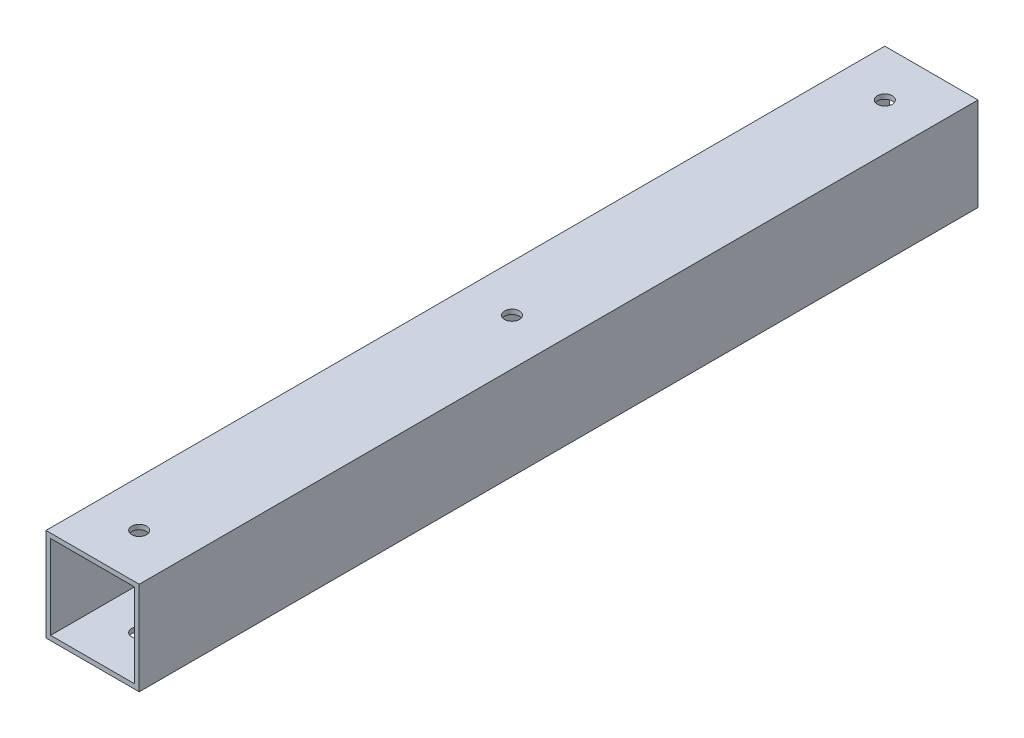
ISO-10303-21;
HEADER;
FILE_DESCRIPTION(('STEP AP214'),'2;1');
FILE_NAME('part.step','',(''),(''),'','','');
FILE_SCHEMA(('AUTOMOTIVE_DESIGN { 1 0 10303 214 1 1 1 1 }'));
ENDSEC;
DATA;
#1=APPLICATION_CONTEXT('core data for automotive mechanical design processes');
#2=APPLICATION_PROTOCOL_DEFINITION('international standard','automotive_design',2000,#1);
#3=PRODUCT_CONTEXT('',#1,'mechanical');
#4=PRODUCT('Part','Part','',(#3));
#5=PRODUCT_RELATED_PRODUCT_CATEGORY('part','',(#4));
#6=PRODUCT_DEFINITION_FORMATION('','',#4);
#7=PRODUCT_DEFINITION_CONTEXT('part definition',#1,'design');
#8=PRODUCT_DEFINITION('design','',#6,#7);
#9=PRODUCT_DEFINITION_SHAPE('','',#8);
#10=(LENGTH_UNIT() NAMED_UNIT(*) SI_UNIT(.MILLI.,.METRE.));
#11=(NAMED_UNIT(*) PLANE_ANGLE_UNIT() SI_UNIT($,.RADIAN.));
#12=(NAMED_UNIT(*) SI_UNIT($,.STERADIAN.) SOLID_ANGLE_UNIT());
#13=UNCERTAINTY_MEASURE_WITH_UNIT(LENGTH_MEASURE(1.E-05),#10,'distance_accuracy_value','');
#14=(GEOMETRIC_REPRESENTATION_CONTEXT(3) GLOBAL_UNCERTAINTY_ASSIGNED_CONTEXT((#13)) GLOBAL_UNIT_ASSIGNED_CONTEXT((#10,
#11,#12)) REPRESENTATION_CONTEXT('',''));
#15=CARTESIAN_POINT('',(0.,0.,0.));
#16=DIRECTION('',(0.,0.,1.));
#17=DIRECTION('',(1.,0.,0.));
#18=AXIS2_PLACEMENT_3D('',#15,#16,#17);
#19=CARTESIAN_POINT('',(0.,0.,180.));
#20=DIRECTION('',(0.,0.,1.));
#21=DIRECTION('',(1.,0.,0.));
#22=AXIS2_PLACEMENT_3D('',#19,#20,#21);
#23=PLANE('',#22);
#24=DIRECTION('',(0.,1.,0.));
#25=VECTOR('',#24,1.);
#26=CARTESIAN_POINT('',(10.,10.,180.));
#27=LINE('',#26,#25);
#28=CARTESIAN_POINT('',(10.,-10.,180.));
#29=VERTEX_POINT('',#28);
#30=CARTESIAN_POINT('',(10.,10.,180.));
#31=VERTEX_POINT('',#30);
#32=EDGE_CURVE('E162',#29,#31,#27,.T.);
#33=ORIENTED_EDGE('',*,*,#32,.T.);
#34=DIRECTION('',(-1.,0.,0.));
#35=VECTOR('',#34,1.);
#36=CARTESIAN_POINT('',(-10.,10.,180.));
#37=LINE('',#36,#35);
#38=CARTESIAN_POINT('',(-10.,10.,180.));
#39=VERTEX_POINT('',#38);
#40=EDGE_CURVE('E170',#31,#39,#37,.T.);
#41=ORIENTED_EDGE('',*,*,#40,.T.);
#42=DIRECTION('',(0.,-1.,0.));
#43=VECTOR('',#42,1.);
#44=CARTESIAN_POINT('',(-10.,10.,180.));
#45=LINE('',#44,#43);
#46=CARTESIAN_POINT('',(-10.,-10.,180.));
#47=VERTEX_POINT('',#46);
#48=EDGE_CURVE('E173',#39,#47,#45,.T.);
#49=ORIENTED_EDGE('',*,*,#48,.T.);
#50=DIRECTION('',(1.,0.,0.));
#51=VECTOR('',#50,1.);
#52=CARTESIAN_POINT('',(-10.,-10.,180.));
#53=LINE('',#52,#51);
#54=EDGE_CURVE('E175',#47,#29,#53,.T.);
#55=ORIENTED_EDGE('',*,*,#54,.T.);
#56=EDGE_LOOP('',(#33,#41,#49,#55));
#57=FACE_BOUND('',#56,.T.);
#58=DIRECTION('',(-1.,0.,0.));
#59=VECTOR('',#58,1.);
#60=CARTESIAN_POINT('',(-9.,9.,180.));
#61=LINE('',#60,#59);
#62=CARTESIAN_POINT('',(9.,9.,180.));
#63=VERTEX_POINT('',#62);
#64=CARTESIAN_POINT('',(-9.,9.,180.));
#65=VERTEX_POINT('',#64);
#66=EDGE_CURVE('E124',#63,#65,#61,.T.);
#67=ORIENTED_EDGE('',*,*,#66,.F.);
#68=DIRECTION('',(0.,1.,0.));
#69=VECTOR('',#68,1.);
#70=CARTESIAN_POINT('',(9.,9.,180.));
#71=LINE('',#70,#69);
#72=CARTESIAN_POINT('',(9.,-9.,180.));
#73=VERTEX_POINT('',#72);
#74=EDGE_CURVE('E114',#73,#63,#71,.T.);
#75=ORIENTED_EDGE('',*,*,#74,.F.);
#76=DIRECTION('',(1.,0.,0.));
#77=VECTOR('',#76,1.);
#78=CARTESIAN_POINT('',(-9.,-9.,180.));
#79=LINE('',#78,#77);
#80=CARTESIAN_POINT('',(-9.,-9.,180.));
#81=VERTEX_POINT('',#80);
#82=EDGE_CURVE('E140',#81,#73,#79,.T.);
#83=ORIENTED_EDGE('',*,*,#82,.F.);
#84=DIRECTION('',(0.,-1.,0.));
#85=VECTOR('',#84,1.);
#86=CARTESIAN_POINT('',(-9.,9.,180.));
#87=LINE('',#86,#85);
#88=EDGE_CURVE('E131',#65,#81,#87,.T.);
#89=ORIENTED_EDGE('',*,*,#88,.F.);
#90=EDGE_LOOP('',(#67,#75,#83,#89));
#91=FACE_BOUND('',#90,.T.);
#92=ADVANCED_FACE('F44',(#57,#91),#23,.T.);
#93=CARTESIAN_POINT('',(0.,0.,0.));
#94=DIRECTION('',(0.,0.,1.));
#95=DIRECTION('',(1.,0.,0.));
#96=AXIS2_PLACEMENT_3D('',#93,#94,#95);
#97=PLANE('',#96);
#98=DIRECTION('',(0.,1.,0.));
#99=VECTOR('',#98,1.);
#100=CARTESIAN_POINT('',(10.,10.,0.));
#101=LINE('',#100,#99);
#102=CARTESIAN_POINT('',(10.,-10.,0.));
#103=VERTEX_POINT('',#102);
#104=CARTESIAN_POINT('',(10.,10.,0.));
#105=VERTEX_POINT('',#104);
#106=EDGE_CURVE('E133',#103,#105,#101,.T.);
#107=ORIENTED_EDGE('',*,*,#106,.F.);
#108=DIRECTION('',(1.,0.,0.));
#109=VECTOR('',#108,1.);
#110=CARTESIAN_POINT('',(-10.,-10.,0.));
#111=LINE('',#110,#109);
#112=CARTESIAN_POINT('',(-10.,-10.,0.));
#113=VERTEX_POINT('',#112);
#114=EDGE_CURVE('E169',#113,#103,#111,.T.);
#115=ORIENTED_EDGE('',*,*,#114,.F.);
#116=DIRECTION('',(0.,-1.,0.));
#117=VECTOR('',#116,1.);
#118=CARTESIAN_POINT('',(-10.,10.,0.));
#119=LINE('',#118,#117);
#120=CARTESIAN_POINT('',(-10.,10.,0.));
#121=VERTEX_POINT('',#120);
#122=EDGE_CURVE('E184',#121,#113,#119,.T.);
#123=ORIENTED_EDGE('',*,*,#122,.F.);
#124=DIRECTION('',(-1.,0.,0.));
#125=VECTOR('',#124,1.);
#126=CARTESIAN_POINT('',(-10.,10.,0.));
#127=LINE('',#126,#125);
#128=EDGE_CURVE('E182',#105,#121,#127,.T.);
#129=ORIENTED_EDGE('',*,*,#128,.F.);
#130=EDGE_LOOP('',(#107,#115,#123,#129));
#131=FACE_BOUND('',#130,.T.);
#132=DIRECTION('',(0.,1.,0.));
#133=VECTOR('',#132,1.);
#134=CARTESIAN_POINT('',(9.,9.,0.));
#135=LINE('',#134,#133);
#136=CARTESIAN_POINT('',(9.,-9.,0.));
#137=VERTEX_POINT('',#136);
#138=CARTESIAN_POINT('',(9.,9.,0.));
#139=VERTEX_POINT('',#138);
#140=EDGE_CURVE('E72',#137,#139,#135,.T.);
#141=ORIENTED_EDGE('',*,*,#140,.T.);
#142=DIRECTION('',(-1.,0.,0.));
#143=VECTOR('',#142,1.);
#144=CARTESIAN_POINT('',(-9.,9.,0.));
#145=LINE('',#144,#143);
#146=CARTESIAN_POINT('',(-9.,9.,0.));
#147=VERTEX_POINT('',#146);
#148=EDGE_CURVE('E129',#139,#147,#145,.T.);
#149=ORIENTED_EDGE('',*,*,#148,.T.);
#150=DIRECTION('',(0.,-1.,0.));
#151=VECTOR('',#150,1.);
#152=CARTESIAN_POINT('',(-9.,9.,0.));
#153=LINE('',#152,#151);
#154=CARTESIAN_POINT('',(-9.,-9.,0.));
#155=VERTEX_POINT('',#154);
#156=EDGE_CURVE('E147',#147,#155,#153,.T.);
#157=ORIENTED_EDGE('',*,*,#156,.T.);
#158=DIRECTION('',(1.,0.,0.));
#159=VECTOR('',#158,1.);
#160=CARTESIAN_POINT('',(-9.,-9.,0.));
#161=LINE('',#160,#159);
#162=EDGE_CURVE('E122',#155,#137,#161,.T.);
#163=ORIENTED_EDGE('',*,*,#162,.T.);
#164=EDGE_LOOP('',(#141,#149,#157,#163));
#165=FACE_BOUND('',#164,.T.);
#166=ADVANCED_FACE('F256',(#131,#165),#97,.F.);
#167=CARTESIAN_POINT('',(10.,10.,180.));
#168=DIRECTION('',(-1.,0.,0.));
#169=DIRECTION('',(0.,-1.,0.));
#170=AXIS2_PLACEMENT_3D('',#167,#168,#169);
#171=PLANE('',#170);
#172=ORIENTED_EDGE('',*,*,#106,.T.);
#173=DIRECTION('',(0.,0.,-1.));
#174=VECTOR('',#173,1.);
#175=CARTESIAN_POINT('',(10.,10.,180.));
#176=LINE('',#175,#174);
#177=EDGE_CURVE('E11',#31,#105,#176,.T.);
#178=ORIENTED_EDGE('',*,*,#177,.F.);
#179=ORIENTED_EDGE('',*,*,#32,.F.);
#180=DIRECTION('',(0.,0.,-1.));
#181=VECTOR('',#180,1.);
#182=CARTESIAN_POINT('',(10.,-10.,180.));
#183=LINE('',#182,#181);
#184=EDGE_CURVE('E179',#29,#103,#183,.T.);
#185=ORIENTED_EDGE('',*,*,#184,.T.);
#186=EDGE_LOOP('',(#172,#178,#179,#185));
#187=FACE_BOUND('',#186,.T.);
#188=ADVANCED_FACE('F50',(#187),#171,.F.);
#189=CARTESIAN_POINT('',(-10.,10.,180.));
#190=DIRECTION('',(0.,-1.,0.));
#191=DIRECTION('',(0.,0.,-1.));
#192=AXIS2_PLACEMENT_3D('',#189,#190,#191);
#193=PLANE('',#192);
#194=CARTESIAN_POINT('',(0.,10.,9.99999999999999));
#195=DIRECTION('',(0.,1.,0.));
#196=DIRECTION('',(0.,0.,1.));
#197=AXIS2_PLACEMENT_3D('',#194,#195,#196);
#198=CIRCLE('',#197,1.6);
#199=CARTESIAN_POINT('',(0.,10.,11.6));
#200=VERTEX_POINT('',#199);
#201=EDGE_CURVE('E281',#200,#200,#198,.T.);
#202=ORIENTED_EDGE('',*,*,#201,.F.);
#203=EDGE_LOOP('',(#202));
#204=FACE_BOUND('',#203,.T.);
#205=CARTESIAN_POINT('',(0.,10.,170.));
#206=DIRECTION('',(0.,1.,0.));
#207=DIRECTION('',(0.,0.,1.));
#208=AXIS2_PLACEMENT_3D('',#205,#206,#207);
#209=CIRCLE('',#208,1.6);
#210=CARTESIAN_POINT('',(0.,10.,171.6));
#211=VERTEX_POINT('',#210);
#212=EDGE_CURVE('E290',#211,#211,#209,.T.);
#213=ORIENTED_EDGE('',*,*,#212,.F.);
#214=EDGE_LOOP('',(#213));
#215=FACE_BOUND('',#214,.T.);
#216=CARTESIAN_POINT('',(0.,10.,90.));
#217=DIRECTION('',(0.,1.,0.));
#218=DIRECTION('',(0.,0.,1.));
#219=AXIS2_PLACEMENT_3D('',#216,#217,#218);
#220=CIRCLE('',#219,1.6);
#221=CARTESIAN_POINT('',(0.,10.,91.6));
#222=VERTEX_POINT('',#221);
#223=EDGE_CURVE('E201',#222,#222,#220,.T.);
#224=ORIENTED_EDGE('',*,*,#223,.F.);
#225=EDGE_LOOP('',(#224));
#226=FACE_BOUND('',#225,.T.);
#227=ORIENTED_EDGE('',*,*,#128,.T.);
#228=DIRECTION('',(0.,0.,-1.));
#229=VECTOR('',#228,1.);
#230=CARTESIAN_POINT('',(-10.,10.,180.));
#231=LINE('',#230,#229);
#232=EDGE_CURVE('E54',#39,#121,#231,.T.);
#233=ORIENTED_EDGE('',*,*,#232,.F.);
#234=ORIENTED_EDGE('',*,*,#40,.F.);
#235=ORIENTED_EDGE('',*,*,#177,.T.);
#236=EDGE_LOOP('',(#227,#233,#234,#235));
#237=FACE_BOUND('',#236,.T.);
#238=ADVANCED_FACE('F272',(#204,#215,#226,#237),#193,.F.);
#239=CARTESIAN_POINT('',(-10.,10.,180.));
#240=DIRECTION('',(1.,0.,0.));
#241=DIRECTION('',(0.,1.,0.));
#242=AXIS2_PLACEMENT_3D('',#239,#240,#241);
#243=PLANE('',#242);
#244=ORIENTED_EDGE('',*,*,#122,.T.);
#245=DIRECTION('',(0.,0.,-1.));
#246=VECTOR('',#245,1.);
#247=CARTESIAN_POINT('',(-10.,-10.,180.));
#248=LINE('',#247,#246);
#249=EDGE_CURVE('E194',#47,#113,#248,.T.);
#250=ORIENTED_EDGE('',*,*,#249,.F.);
#251=ORIENTED_EDGE('',*,*,#48,.F.);
#252=ORIENTED_EDGE('',*,*,#232,.T.);
#253=EDGE_LOOP('',(#244,#250,#251,#252));
#254=FACE_BOUND('',#253,.T.);
#255=ADVANCED_FACE('F271',(#254),#243,.F.);
#256=CARTESIAN_POINT('',(-10.,-10.,180.));
#257=DIRECTION('',(0.,1.,0.));
#258=DIRECTION('',(0.,0.,1.));
#259=AXIS2_PLACEMENT_3D('',#256,#257,#258);
#260=PLANE('',#259);
#261=CARTESIAN_POINT('',(0.,-10.,9.99999999999999));
#262=DIRECTION('',(0.,1.,0.));
#263=DIRECTION('',(0.,0.,1.));
#264=AXIS2_PLACEMENT_3D('',#261,#262,#263);
#265=CIRCLE('',#264,1.6);
#266=CARTESIAN_POINT('',(0.,-10.,11.6));
#267=VERTEX_POINT('',#266);
#268=EDGE_CURVE('E150',#267,#267,#265,.T.);
#269=ORIENTED_EDGE('',*,*,#268,.T.);
#270=EDGE_LOOP('',(#269));
#271=FACE_BOUND('',#270,.T.);
#272=CARTESIAN_POINT('',(0.,-10.,170.));
#273=DIRECTION('',(0.,1.,0.));
#274=DIRECTION('',(0.,0.,1.));
#275=AXIS2_PLACEMENT_3D('',#272,#273,#274);
#276=CIRCLE('',#275,1.6);
#277=CARTESIAN_POINT('',(0.,-10.,171.6));
#278=VERTEX_POINT('',#277);
#279=EDGE_CURVE('E212',#278,#278,#276,.T.);
#280=ORIENTED_EDGE('',*,*,#279,.T.);
#281=EDGE_LOOP('',(#280));
#282=FACE_BOUND('',#281,.T.);
#283=CARTESIAN_POINT('',(0.,-10.,90.));
#284=DIRECTION('',(0.,1.,0.));
#285=DIRECTION('',(0.,0.,1.));
#286=AXIS2_PLACEMENT_3D('',#283,#284,#285);
#287=CIRCLE('',#286,1.6);
#288=CARTESIAN_POINT('',(0.,-10.,91.6));
#289=VERTEX_POINT('',#288);
#290=EDGE_CURVE('E208',#289,#289,#287,.T.);
#291=ORIENTED_EDGE('',*,*,#290,.T.);
#292=EDGE_LOOP('',(#291));
#293=FACE_BOUND('',#292,.T.);
#294=ORIENTED_EDGE('',*,*,#114,.T.);
#295=ORIENTED_EDGE('',*,*,#184,.F.);
#296=ORIENTED_EDGE('',*,*,#54,.F.);
#297=ORIENTED_EDGE('',*,*,#249,.T.);
#298=EDGE_LOOP('',(#294,#295,#296,#297));
#299=FACE_BOUND('',#298,.T.);
#300=ADVANCED_FACE('F231',(#271,#282,#293,#299),#260,.F.);
#301=CARTESIAN_POINT('',(9.,9.,180.));
#302=DIRECTION('',(-1.,0.,0.));
#303=DIRECTION('',(0.,0.,1.));
#304=AXIS2_PLACEMENT_3D('',#301,#302,#303);
#305=PLANE('',#304);
#306=ORIENTED_EDGE('',*,*,#140,.F.);
#307=DIRECTION('',(0.,0.,-1.));
#308=VECTOR('',#307,1.);
#309=CARTESIAN_POINT('',(9.,-9.,180.));
#310=LINE('',#309,#308);
#311=EDGE_CURVE('E119',#73,#137,#310,.T.);
#312=ORIENTED_EDGE('',*,*,#311,.F.);
#313=ORIENTED_EDGE('',*,*,#74,.T.);
#314=DIRECTION('',(0.,0.,-1.));
#315=VECTOR('',#314,1.);
#316=CARTESIAN_POINT('',(9.,9.,180.));
#317=LINE('',#316,#315);
#318=EDGE_CURVE('E118',#63,#139,#317,.T.);
#319=ORIENTED_EDGE('',*,*,#318,.T.);
#320=EDGE_LOOP('',(#306,#312,#313,#319));
#321=FACE_BOUND('',#320,.T.);
#322=ADVANCED_FACE('F113',(#321),#305,.T.);
#323=CARTESIAN_POINT('',(-9.,9.,180.));
#324=DIRECTION('',(0.,-1.,0.));
#325=DIRECTION('',(0.,0.,-1.));
#326=AXIS2_PLACEMENT_3D('',#323,#324,#325);
#327=PLANE('',#326);
#328=CARTESIAN_POINT('',(0.,9.,9.99999999999999));
#329=DIRECTION('',(0.,-1.,0.));
#330=DIRECTION('',(0.,0.,-1.));
#331=AXIS2_PLACEMENT_3D('',#328,#329,#330);
#332=CIRCLE('',#331,1.6);
#333=CARTESIAN_POINT('',(0.,9.,8.4));
#334=VERTEX_POINT('',#333);
#335=EDGE_CURVE('E227',#334,#334,#332,.T.);
#336=ORIENTED_EDGE('',*,*,#335,.F.);
#337=EDGE_LOOP('',(#336));
#338=FACE_BOUND('',#337,.T.);
#339=CARTESIAN_POINT('',(0.,9.,170.));
#340=DIRECTION('',(0.,-1.,0.));
#341=DIRECTION('',(0.,0.,-1.));
#342=AXIS2_PLACEMENT_3D('',#339,#340,#341);
#343=CIRCLE('',#342,1.6);
#344=CARTESIAN_POINT('',(0.,9.,168.4));
#345=VERTEX_POINT('',#344);
#346=EDGE_CURVE('E210',#345,#345,#343,.T.);
#347=ORIENTED_EDGE('',*,*,#346,.F.);
#348=EDGE_LOOP('',(#347));
#349=FACE_BOUND('',#348,.T.);
#350=CARTESIAN_POINT('',(0.,9.,90.));
#351=DIRECTION('',(0.,-1.,0.));
#352=DIRECTION('',(0.,0.,-1.));
#353=AXIS2_PLACEMENT_3D('',#350,#351,#352);
#354=CIRCLE('',#353,1.6);
#355=CARTESIAN_POINT('',(0.,9.,88.4));
#356=VERTEX_POINT('',#355);
#357=EDGE_CURVE('E205',#356,#356,#354,.T.);
#358=ORIENTED_EDGE('',*,*,#357,.F.);
#359=EDGE_LOOP('',(#358));
#360=FACE_BOUND('',#359,.T.);
#361=ORIENTED_EDGE('',*,*,#148,.F.);
#362=ORIENTED_EDGE('',*,*,#318,.F.);
#363=ORIENTED_EDGE('',*,*,#66,.T.);
#364=DIRECTION('',(0.,0.,-1.));
#365=VECTOR('',#364,1.);
#366=CARTESIAN_POINT('',(-9.,9.,180.));
#367=LINE('',#366,#365);
#368=EDGE_CURVE('E134',#65,#147,#367,.T.);
#369=ORIENTED_EDGE('',*,*,#368,.T.);
#370=EDGE_LOOP('',(#361,#362,#363,#369));
#371=FACE_BOUND('',#370,.T.);
#372=ADVANCED_FACE('F127',(#338,#349,#360,#371),#327,.T.);
#373=CARTESIAN_POINT('',(-9.,9.,180.));
#374=DIRECTION('',(1.,0.,0.));
#375=DIRECTION('',(0.,1.,0.));
#376=AXIS2_PLACEMENT_3D('',#373,#374,#375);
#377=PLANE('',#376);
#378=ORIENTED_EDGE('',*,*,#156,.F.);
#379=ORIENTED_EDGE('',*,*,#368,.F.);
#380=ORIENTED_EDGE('',*,*,#88,.T.);
#381=DIRECTION('',(0.,0.,-1.));
#382=VECTOR('',#381,1.);
#383=CARTESIAN_POINT('',(-9.,-9.,180.));
#384=LINE('',#383,#382);
#385=EDGE_CURVE('E62',#81,#155,#384,.T.);
#386=ORIENTED_EDGE('',*,*,#385,.T.);
#387=EDGE_LOOP('',(#378,#379,#380,#386));
#388=FACE_BOUND('',#387,.T.);
#389=ADVANCED_FACE('F306',(#388),#377,.T.);
#390=CARTESIAN_POINT('',(-9.,-9.,180.));
#391=DIRECTION('',(0.,1.,0.));
#392=DIRECTION('',(0.,0.,1.));
#393=AXIS2_PLACEMENT_3D('',#390,#391,#392);
#394=PLANE('',#393);
#395=CARTESIAN_POINT('',(0.,-9.,9.99999999999999));
#396=DIRECTION('',(0.,1.,0.));
#397=DIRECTION('',(0.,0.,1.));
#398=AXIS2_PLACEMENT_3D('',#395,#396,#397);
#399=CIRCLE('',#398,1.6);
#400=CARTESIAN_POINT('',(0.,-9.,11.6));
#401=VERTEX_POINT('',#400);
#402=EDGE_CURVE('E47',#401,#401,#399,.T.);
#403=ORIENTED_EDGE('',*,*,#402,.F.);
#404=EDGE_LOOP('',(#403));
#405=FACE_BOUND('',#404,.T.);
#406=CARTESIAN_POINT('',(0.,-9.,170.));
#407=DIRECTION('',(0.,1.,0.));
#408=DIRECTION('',(0.,0.,1.));
#409=AXIS2_PLACEMENT_3D('',#406,#407,#408);
#410=CIRCLE('',#409,1.6);
#411=CARTESIAN_POINT('',(0.,-9.,171.6));
#412=VERTEX_POINT('',#411);
#413=EDGE_CURVE('E204',#412,#412,#410,.T.);
#414=ORIENTED_EDGE('',*,*,#413,.F.);
#415=EDGE_LOOP('',(#414));
#416=FACE_BOUND('',#415,.T.);
#417=CARTESIAN_POINT('',(0.,-9.,90.));
#418=DIRECTION('',(0.,1.,0.));
#419=DIRECTION('',(0.,0.,1.));
#420=AXIS2_PLACEMENT_3D('',#417,#418,#419);
#421=CIRCLE('',#420,1.6);
#422=CARTESIAN_POINT('',(0.,-9.,91.6));
#423=VERTEX_POINT('',#422);
#424=EDGE_CURVE('E200',#423,#423,#421,.T.);
#425=ORIENTED_EDGE('',*,*,#424,.F.);
#426=EDGE_LOOP('',(#425));
#427=FACE_BOUND('',#426,.T.);
#428=ORIENTED_EDGE('',*,*,#162,.F.);
#429=ORIENTED_EDGE('',*,*,#385,.F.);
#430=ORIENTED_EDGE('',*,*,#82,.T.);
#431=ORIENTED_EDGE('',*,*,#311,.T.);
#432=EDGE_LOOP('',(#428,#429,#430,#431));
#433=FACE_BOUND('',#432,.T.);
#434=ADVANCED_FACE('F308',(#405,#416,#427,#433),#394,.T.);
#435=CARTESIAN_POINT('',(0.,-40.,90.));
#436=DIRECTION('',(0.,1.,0.));
#437=DIRECTION('',(0.,0.,1.));
#438=AXIS2_PLACEMENT_3D('',#435,#436,#437);
#439=CYLINDRICAL_SURFACE('',#438,1.6);
#440=CARTESIAN_POINT('',(0.,-9.,91.6));
#441=CARTESIAN_POINT('',(0.,-9.01041666666667,91.6));
#442=CARTESIAN_POINT('',(0.,-9.02083333333333,91.6));
#443=CARTESIAN_POINT('',(0.,-9.04166666666667,91.6));
#444=CARTESIAN_POINT('',(0.,-9.05208333333333,91.6));
#445=CARTESIAN_POINT('',(0.,-9.07291666666667,91.6));
#446=CARTESIAN_POINT('',(0.,-9.08333333333333,91.6));
#447=CARTESIAN_POINT('',(0.,-9.10416666666667,91.6));
#448=CARTESIAN_POINT('',(0.,-9.11458333333333,91.6));
#449=CARTESIAN_POINT('',(0.,-9.13541666666667,91.6));
#450=CARTESIAN_POINT('',(0.,-9.14583333333333,91.6));
#451=CARTESIAN_POINT('',(0.,-9.16666666666667,91.6));
#452=CARTESIAN_POINT('',(0.,-9.17708333333333,91.6));
#453=CARTESIAN_POINT('',(0.,-9.19791666666667,91.6));
#454=CARTESIAN_POINT('',(0.,-9.20833333333333,91.6));
#455=CARTESIAN_POINT('',(0.,-9.22916666666667,91.6));
#456=CARTESIAN_POINT('',(0.,-9.23958333333333,91.6));
#457=CARTESIAN_POINT('',(0.,-9.26041666666667,91.6));
#458=CARTESIAN_POINT('',(0.,-9.27083333333333,91.6));
#459=CARTESIAN_POINT('',(0.,-9.29166666666667,91.6));
#460=CARTESIAN_POINT('',(0.,-9.30208333333333,91.6));
#461=CARTESIAN_POINT('',(0.,-9.32291666666667,91.6));
#462=CARTESIAN_POINT('',(0.,-9.33333333333333,91.6));
#463=CARTESIAN_POINT('',(0.,-9.35416666666667,91.6));
#464=CARTESIAN_POINT('',(0.,-9.36458333333333,91.6));
#465=CARTESIAN_POINT('',(0.,-9.38541666666667,91.6));
#466=CARTESIAN_POINT('',(0.,-9.39583333333333,91.6));
#467=CARTESIAN_POINT('',(0.,-9.41666666666667,91.6));
#468=CARTESIAN_POINT('',(0.,-9.42708333333333,91.6));
#469=CARTESIAN_POINT('',(0.,-9.44791666666667,91.6));
#470=CARTESIAN_POINT('',(0.,-9.45833333333333,91.6));
#471=CARTESIAN_POINT('',(0.,-9.47916666666667,91.6));
#472=CARTESIAN_POINT('',(0.,-9.48958333333333,91.6));
#473=CARTESIAN_POINT('',(0.,-9.51041666666667,91.6));
#474=CARTESIAN_POINT('',(0.,-9.52083333333333,91.6));
#475=CARTESIAN_POINT('',(0.,-9.54166666666667,91.6));
#476=CARTESIAN_POINT('',(0.,-9.55208333333333,91.6));
#477=CARTESIAN_POINT('',(0.,-9.57291666666667,91.6));
#478=CARTESIAN_POINT('',(0.,-9.58333333333333,91.6));
#479=CARTESIAN_POINT('',(0.,-9.60416666666667,91.6));
#480=CARTESIAN_POINT('',(0.,-9.61458333333333,91.6));
#481=CARTESIAN_POINT('',(0.,-9.63541666666667,91.6));
#482=CARTESIAN_POINT('',(0.,-9.64583333333333,91.6));
#483=CARTESIAN_POINT('',(0.,-9.66666666666667,91.6));
#484=CARTESIAN_POINT('',(0.,-9.67708333333333,91.6));
#485=CARTESIAN_POINT('',(0.,-9.69791666666667,91.6));
#486=CARTESIAN_POINT('',(0.,-9.70833333333333,91.6));
#487=CARTESIAN_POINT('',(0.,-9.72916666666667,91.6));
#488=CARTESIAN_POINT('',(0.,-9.73958333333333,91.6));
#489=CARTESIAN_POINT('',(0.,-9.76041666666667,91.6));
#490=CARTESIAN_POINT('',(0.,-9.77083333333333,91.6));
#491=CARTESIAN_POINT('',(0.,-9.79166666666667,91.6));
#492=CARTESIAN_POINT('',(0.,-9.80208333333333,91.6));
#493=CARTESIAN_POINT('',(0.,-9.82291666666667,91.6));
#494=CARTESIAN_POINT('',(0.,-9.83333333333333,91.6));
#495=CARTESIAN_POINT('',(0.,-9.85416666666667,91.6));
#496=CARTESIAN_POINT('',(0.,-9.86458333333333,91.6));
#497=CARTESIAN_POINT('',(0.,-9.88541666666667,91.6));
#498=CARTESIAN_POINT('',(0.,-9.89583333333333,91.6));
#499=CARTESIAN_POINT('',(0.,-9.91666666666667,91.6));
#500=CARTESIAN_POINT('',(0.,-9.92708333333333,91.6));
#501=CARTESIAN_POINT('',(0.,-9.94791666666667,91.6));
#502=CARTESIAN_POINT('',(0.,-9.95833333333333,91.6));
#503=CARTESIAN_POINT('',(0.,-9.97916666666667,91.6));
#504=CARTESIAN_POINT('',(0.,-9.98958333333333,91.6));
#505=CARTESIAN_POINT('',(0.,-10.,91.6));
#506=B_SPLINE_CURVE_WITH_KNOTS('',3,(#440,#441,#442,#443,#444,#445,#446,#447,#448,#449,#450,
#451,#452,#453,#454,#455,#456,#457,#458,#459,#460,#461,#462,#463,#464,#465,#466,#467,#468,#469,
#470,#471,#472,#473,#474,#475,#476,#477,#478,#479,#480,#481,#482,#483,#484,#485,#486,#487,#488,
#489,#490,#491,#492,#493,#494,#495,#496,#497,#498,#499,#500,#501,#502,#503,#504,#505),
.UNSPECIFIED.,.F.,.F.,(4,2,2,2,2,2,2,2,2,2,2,2,2,2,2,2,2,2,2,2,2,2,2,2,2,2,2,2,2,2,2,2,4),(0.,
0.03125,0.0625000000000001,0.0937500000000001,0.125,0.15625,0.1875,0.21875,0.25,0.28125,0.3125,
0.34375,0.375,0.40625,0.4375,0.46875,0.5,0.53125,0.5625,0.593750000000001,0.625000000000001,
0.656250000000001,0.687500000000001,0.718750000000001,0.750000000000001,0.781250000000001,
0.812500000000001,0.843750000000001,0.875000000000001,0.906250000000001,0.937500000000001,
0.968750000000001,1.),.UNSPECIFIED.);
#507=EDGE_CURVE('BSEAM252',#423,#289,#506,.T.);
#508=ORIENTED_EDGE('',*,*,#424,.T.);
#509=ORIENTED_EDGE('',*,*,#290,.F.);
#510=ORIENTED_EDGE('',*,*,#507,.T.);
#511=ORIENTED_EDGE('',*,*,#507,.F.);
#512=EDGE_LOOP('',(#508,#510,#509,#511));
#513=FACE_BOUND('',#512,.T.);
#514=ADVANCED_FACE('F252',(#513),#439,.F.);
#515=CARTESIAN_POINT('',(0.,-40.,170.));
#516=DIRECTION('',(0.,1.,0.));
#517=DIRECTION('',(0.,0.,1.));
#518=AXIS2_PLACEMENT_3D('',#515,#516,#517);
#519=CYLINDRICAL_SURFACE('',#518,1.6);
#520=CARTESIAN_POINT('',(0.,-9.,171.6));
#521=CARTESIAN_POINT('',(0.,-9.01041666666667,171.6));
#522=CARTESIAN_POINT('',(0.,-9.02083333333333,171.6));
#523=CARTESIAN_POINT('',(0.,-9.04166666666667,171.6));
#524=CARTESIAN_POINT('',(0.,-9.05208333333333,171.6));
#525=CARTESIAN_POINT('',(0.,-9.07291666666667,171.6));
#526=CARTESIAN_POINT('',(0.,-9.08333333333333,171.6));
#527=CARTESIAN_POINT('',(0.,-9.10416666666667,171.6));
#528=CARTESIAN_POINT('',(0.,-9.11458333333333,171.6));
#529=CARTESIAN_POINT('',(0.,-9.13541666666667,171.6));
#530=CARTESIAN_POINT('',(0.,-9.14583333333333,171.6));
#531=CARTESIAN_POINT('',(0.,-9.16666666666667,171.6));
#532=CARTESIAN_POINT('',(0.,-9.17708333333333,171.6));
#533=CARTESIAN_POINT('',(0.,-9.19791666666667,171.6));
#534=CARTESIAN_POINT('',(0.,-9.20833333333333,171.6));
#535=CARTESIAN_POINT('',(0.,-9.22916666666667,171.6));
#536=CARTESIAN_POINT('',(0.,-9.23958333333333,171.6));
#537=CARTESIAN_POINT('',(0.,-9.26041666666667,171.6));
#538=CARTESIAN_POINT('',(0.,-9.27083333333333,171.6));
#539=CARTESIAN_POINT('',(0.,-9.29166666666667,171.6));
#540=CARTESIAN_POINT('',(0.,-9.30208333333333,171.6));
#541=CARTESIAN_POINT('',(0.,-9.32291666666667,171.6));
#542=CARTESIAN_POINT('',(0.,-9.33333333333333,171.6));
#543=CARTESIAN_POINT('',(0.,-9.35416666666667,171.6));
#544=CARTESIAN_POINT('',(0.,-9.36458333333333,171.6));
#545=CARTESIAN_POINT('',(0.,-9.38541666666667,171.6));
#546=CARTESIAN_POINT('',(0.,-9.39583333333333,171.6));
#547=CARTESIAN_POINT('',(0.,-9.41666666666667,171.6));
#548=CARTESIAN_POINT('',(0.,-9.42708333333333,171.6));
#549=CARTESIAN_POINT('',(0.,-9.44791666666667,171.6));
#550=CARTESIAN_POINT('',(0.,-9.45833333333333,171.6));
#551=CARTESIAN_POINT('',(0.,-9.47916666666667,171.6));
#552=CARTESIAN_POINT('',(0.,-9.48958333333333,171.6));
#553=CARTESIAN_POINT('',(0.,-9.51041666666667,171.6));
#554=CARTESIAN_POINT('',(0.,-9.52083333333333,171.6));
#555=CARTESIAN_POINT('',(0.,-9.54166666666667,171.6));
#556=CARTESIAN_POINT('',(0.,-9.55208333333333,171.6));
#557=CARTESIAN_POINT('',(0.,-9.57291666666667,171.6));
#558=CARTESIAN_POINT('',(0.,-9.58333333333333,171.6));
#559=CARTESIAN_POINT('',(0.,-9.60416666666667,171.6));
#560=CARTESIAN_POINT('',(0.,-9.61458333333333,171.6));
#561=CARTESIAN_POINT('',(0.,-9.63541666666667,171.6));
#562=CARTESIAN_POINT('',(0.,-9.64583333333333,171.6));
#563=CARTESIAN_POINT('',(0.,-9.66666666666667,171.6));
#564=CARTESIAN_POINT('',(0.,-9.67708333333333,171.6));
#565=CARTESIAN_POINT('',(0.,-9.69791666666667,171.6));
#566=CARTESIAN_POINT('',(0.,-9.70833333333333,171.6));
#567=CARTESIAN_POINT('',(0.,-9.72916666666667,171.6));
#568=CARTESIAN_POINT('',(0.,-9.73958333333333,171.6));
#569=CARTESIAN_POINT('',(0.,-9.76041666666667,171.6));
#570=CARTESIAN_POINT('',(0.,-9.77083333333333,171.6));
#571=CARTESIAN_POINT('',(0.,-9.79166666666667,171.6));
#572=CARTESIAN_POINT('',(0.,-9.80208333333333,171.6));
#573=CARTESIAN_POINT('',(0.,-9.82291666666667,171.6));
#574=CARTESIAN_POINT('',(0.,-9.83333333333333,171.6));
#575=CARTESIAN_POINT('',(0.,-9.85416666666667,171.6));
#576=CARTESIAN_POINT('',(0.,-9.86458333333333,171.6));
#577=CARTESIAN_POINT('',(0.,-9.88541666666667,171.6));
#578=CARTESIAN_POINT('',(0.,-9.89583333333333,171.6));
#579=CARTESIAN_POINT('',(0.,-9.91666666666667,171.6));
#580=CARTESIAN_POINT('',(0.,-9.92708333333333,171.6));
#581=CARTESIAN_POINT('',(0.,-9.94791666666667,171.6));
#582=CARTESIAN_POINT('',(0.,-9.95833333333333,171.6));
#583=CARTESIAN_POINT('',(0.,-9.97916666666667,171.6));
#584=CARTESIAN_POINT('',(0.,-9.98958333333333,171.6));
#585=CARTESIAN_POINT('',(0.,-10.,171.6));
#586=B_SPLINE_CURVE_WITH_KNOTS('',3,(#520,#521,#522,#523,#524,#525,#526,#527,#528,#529,#530,
#531,#532,#533,#534,#535,#536,#537,#538,#539,#540,#541,#542,#543,#544,#545,#546,#547,#548,#549,
#550,#551,#552,#553,#554,#555,#556,#557,#558,#559,#560,#561,#562,#563,#564,#565,#566,#567,#568,
#569,#570,#571,#572,#573,#574,#575,#576,#577,#578,#579,#580,#581,#582,#583,#584,#585),
.UNSPECIFIED.,.F.,.F.,(4,2,2,2,2,2,2,2,2,2,2,2,2,2,2,2,2,2,2,2,2,2,2,2,2,2,2,2,2,2,2,2,4),(0.,
0.03125,0.0625000000000001,0.0937500000000001,0.125,0.15625,0.1875,0.21875,0.25,0.28125,0.3125,
0.34375,0.375,0.40625,0.4375,0.46875,0.5,0.53125,0.5625,0.593750000000001,0.625000000000001,
0.656250000000001,0.687500000000001,0.718750000000001,0.750000000000001,0.781250000000001,
0.812500000000001,0.843750000000001,0.875000000000001,0.906250000000001,0.937500000000001,
0.968750000000001,1.),.UNSPECIFIED.);
#587=EDGE_CURVE('BSEAM243',#412,#278,#586,.T.);
#588=ORIENTED_EDGE('',*,*,#413,.T.);
#589=ORIENTED_EDGE('',*,*,#279,.F.);
#590=ORIENTED_EDGE('',*,*,#587,.T.);
#591=ORIENTED_EDGE('',*,*,#587,.F.);
#592=EDGE_LOOP('',(#588,#590,#589,#591));
#593=FACE_BOUND('',#592,.T.);
#594=ADVANCED_FACE('F243',(#593),#519,.F.);
#595=CARTESIAN_POINT('',(0.,-40.,9.99999999999999));
#596=DIRECTION('',(0.,1.,0.));
#597=DIRECTION('',(0.,0.,1.));
#598=AXIS2_PLACEMENT_3D('',#595,#596,#597);
#599=CYLINDRICAL_SURFACE('',#598,1.6);
#600=CARTESIAN_POINT('',(0.,-9.,11.6));
#601=CARTESIAN_POINT('',(0.,-9.01041666666667,11.6));
#602=CARTESIAN_POINT('',(0.,-9.02083333333333,11.6));
#603=CARTESIAN_POINT('',(0.,-9.04166666666667,11.6));
#604=CARTESIAN_POINT('',(0.,-9.05208333333333,11.6));
#605=CARTESIAN_POINT('',(0.,-9.07291666666667,11.6));
#606=CARTESIAN_POINT('',(0.,-9.08333333333333,11.6));
#607=CARTESIAN_POINT('',(0.,-9.10416666666667,11.6));
#608=CARTESIAN_POINT('',(0.,-9.11458333333333,11.6));
#609=CARTESIAN_POINT('',(0.,-9.13541666666667,11.6));
#610=CARTESIAN_POINT('',(0.,-9.14583333333333,11.6));
#611=CARTESIAN_POINT('',(0.,-9.16666666666667,11.6));
#612=CARTESIAN_POINT('',(0.,-9.17708333333333,11.6));
#613=CARTESIAN_POINT('',(0.,-9.19791666666667,11.6));
#614=CARTESIAN_POINT('',(0.,-9.20833333333333,11.6));
#615=CARTESIAN_POINT('',(0.,-9.22916666666667,11.6));
#616=CARTESIAN_POINT('',(0.,-9.23958333333333,11.6));
#617=CARTESIAN_POINT('',(0.,-9.26041666666667,11.6));
#618=CARTESIAN_POINT('',(0.,-9.27083333333333,11.6));
#619=CARTESIAN_POINT('',(0.,-9.29166666666667,11.6));
#620=CARTESIAN_POINT('',(0.,-9.30208333333333,11.6));
#621=CARTESIAN_POINT('',(0.,-9.32291666666667,11.6));
#622=CARTESIAN_POINT('',(0.,-9.33333333333333,11.6));
#623=CARTESIAN_POINT('',(0.,-9.35416666666667,11.6));
#624=CARTESIAN_POINT('',(0.,-9.36458333333333,11.6));
#625=CARTESIAN_POINT('',(0.,-9.38541666666667,11.6));
#626=CARTESIAN_POINT('',(0.,-9.39583333333333,11.6));
#627=CARTESIAN_POINT('',(0.,-9.41666666666667,11.6));
#628=CARTESIAN_POINT('',(0.,-9.42708333333333,11.6));
#629=CARTESIAN_POINT('',(0.,-9.44791666666667,11.6));
#630=CARTESIAN_POINT('',(0.,-9.45833333333333,11.6));
#631=CARTESIAN_POINT('',(0.,-9.47916666666667,11.6));
#632=CARTESIAN_POINT('',(0.,-9.48958333333333,11.6));
#633=CARTESIAN_POINT('',(0.,-9.51041666666667,11.6));
#634=CARTESIAN_POINT('',(0.,-9.52083333333333,11.6));
#635=CARTESIAN_POINT('',(0.,-9.54166666666667,11.6));
#636=CARTESIAN_POINT('',(0.,-9.55208333333333,11.6));
#637=CARTESIAN_POINT('',(0.,-9.57291666666667,11.6));
#638=CARTESIAN_POINT('',(0.,-9.58333333333333,11.6));
#639=CARTESIAN_POINT('',(0.,-9.60416666666667,11.6));
#640=CARTESIAN_POINT('',(0.,-9.61458333333333,11.6));
#641=CARTESIAN_POINT('',(0.,-9.63541666666667,11.6));
#642=CARTESIAN_POINT('',(0.,-9.64583333333333,11.6));
#643=CARTESIAN_POINT('',(0.,-9.66666666666667,11.6));
#644=CARTESIAN_POINT('',(0.,-9.67708333333333,11.6));
#645=CARTESIAN_POINT('',(0.,-9.69791666666667,11.6));
#646=CARTESIAN_POINT('',(0.,-9.70833333333333,11.6));
#647=CARTESIAN_POINT('',(0.,-9.72916666666667,11.6));
#648=CARTESIAN_POINT('',(0.,-9.73958333333333,11.6));
#649=CARTESIAN_POINT('',(0.,-9.76041666666667,11.6));
#650=CARTESIAN_POINT('',(0.,-9.77083333333333,11.6));
#651=CARTESIAN_POINT('',(0.,-9.79166666666667,11.6));
#652=CARTESIAN_POINT('',(0.,-9.80208333333333,11.6));
#653=CARTESIAN_POINT('',(0.,-9.82291666666667,11.6));
#654=CARTESIAN_POINT('',(0.,-9.83333333333333,11.6));
#655=CARTESIAN_POINT('',(0.,-9.85416666666667,11.6));
#656=CARTESIAN_POINT('',(0.,-9.86458333333333,11.6));
#657=CARTESIAN_POINT('',(0.,-9.88541666666667,11.6));
#658=CARTESIAN_POINT('',(0.,-9.89583333333333,11.6));
#659=CARTESIAN_POINT('',(0.,-9.91666666666667,11.6));
#660=CARTESIAN_POINT('',(0.,-9.92708333333333,11.6));
#661=CARTESIAN_POINT('',(0.,-9.94791666666667,11.6));
#662=CARTESIAN_POINT('',(0.,-9.95833333333333,11.6));
#663=CARTESIAN_POINT('',(0.,-9.97916666666667,11.6));
#664=CARTESIAN_POINT('',(0.,-9.98958333333333,11.6));
#665=CARTESIAN_POINT('',(0.,-10.,11.6));
#666=B_SPLINE_CURVE_WITH_KNOTS('',3,(#600,#601,#602,#603,#604,#605,#606,#607,#608,#609,#610,
#611,#612,#613,#614,#615,#616,#617,#618,#619,#620,#621,#622,#623,#624,#625,#626,#627,#628,#629,
#630,#631,#632,#633,#634,#635,#636,#637,#638,#639,#640,#641,#642,#643,#644,#645,#646,#647,#648,
#649,#650,#651,#652,#653,#654,#655,#656,#657,#658,#659,#660,#661,#662,#663,#664,#665),
.UNSPECIFIED.,.F.,.F.,(4,2,2,2,2,2,2,2,2,2,2,2,2,2,2,2,2,2,2,2,2,2,2,2,2,2,2,2,2,2,2,2,4),(0.,
0.03125,0.0625000000000001,0.0937500000000001,0.125,0.15625,0.1875,0.21875,0.25,0.28125,0.3125,
0.34375,0.375,0.40625,0.4375,0.46875,0.5,0.53125,0.5625,0.593750000000001,0.625000000000001,
0.656250000000001,0.687500000000001,0.718750000000001,0.750000000000001,0.781250000000001,
0.812500000000001,0.843750000000001,0.875000000000001,0.906250000000001,0.937500000000001,
0.968750000000001,1.),.UNSPECIFIED.);
#667=EDGE_CURVE('BSEAM236',#401,#267,#666,.T.);
#668=ORIENTED_EDGE('',*,*,#402,.T.);
#669=ORIENTED_EDGE('',*,*,#268,.F.);
#670=ORIENTED_EDGE('',*,*,#667,.T.);
#671=ORIENTED_EDGE('',*,*,#667,.F.);
#672=EDGE_LOOP('',(#668,#670,#669,#671));
#673=FACE_BOUND('',#672,.T.);
#674=ADVANCED_FACE('F236',(#673),#599,.F.);
#675=ORIENTED_EDGE('',*,*,#357,.T.);
#676=EDGE_LOOP('',(#675));
#677=FACE_BOUND('',#676,.T.);
#678=ORIENTED_EDGE('',*,*,#223,.T.);
#679=EDGE_LOOP('',(#678));
#680=FACE_BOUND('',#679,.T.);
#681=ADVANCED_FACE('F238',(#677,#680),#439,.F.);
#682=ORIENTED_EDGE('',*,*,#346,.T.);
#683=EDGE_LOOP('',(#682));
#684=FACE_BOUND('',#683,.T.);
#685=ORIENTED_EDGE('',*,*,#212,.T.);
#686=EDGE_LOOP('',(#685));
#687=FACE_BOUND('',#686,.T.);
#688=ADVANCED_FACE('F250',(#684,#687),#519,.F.);
#689=ORIENTED_EDGE('',*,*,#335,.T.);
#690=EDGE_LOOP('',(#689));
#691=FACE_BOUND('',#690,.T.);
#692=ORIENTED_EDGE('',*,*,#201,.T.);
#693=EDGE_LOOP('',(#692));
#694=FACE_BOUND('',#693,.T.);
#695=ADVANCED_FACE('F245',(#691,#694),#599,.F.);
#696=CLOSED_SHELL('',(#92,#166,#188,#238,#255,#300,#322,#372,#389,#434,#514,#594,#674,#681,#688,#695));
#697=MANIFOLD_SOLID_BREP('B2',#696);
#698=ADVANCED_BREP_SHAPE_REPRESENTATION('',(#18,#697),#14);
#699=SHAPE_DEFINITION_REPRESENTATION(#9,#698);
ENDSEC;
END-ISO-10303-21;
